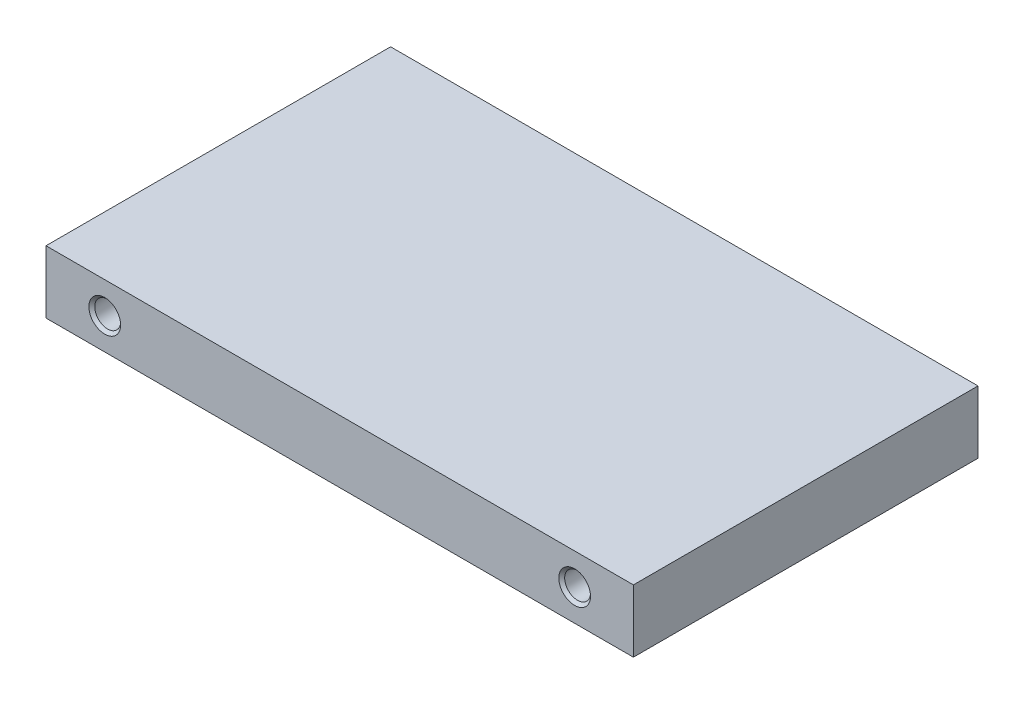
ISO-10303-21;
HEADER;
FILE_DESCRIPTION(('STEP AP214'),'2;1');
FILE_NAME('part.step','',(''),(''),'','','');
FILE_SCHEMA(('AUTOMOTIVE_DESIGN { 1 0 10303 214 1 1 1 1 }'));
ENDSEC;
DATA;
#1=APPLICATION_CONTEXT('core data for automotive mechanical design processes');
#2=APPLICATION_PROTOCOL_DEFINITION('international standard','automotive_design',2000,#1);
#3=PRODUCT_CONTEXT('',#1,'mechanical');
#4=PRODUCT('Part','Part','',(#3));
#5=PRODUCT_RELATED_PRODUCT_CATEGORY('part','',(#4));
#6=PRODUCT_DEFINITION_FORMATION('','',#4);
#7=PRODUCT_DEFINITION_CONTEXT('part definition',#1,'design');
#8=PRODUCT_DEFINITION('design','',#6,#7);
#9=PRODUCT_DEFINITION_SHAPE('','',#8);
#10=(LENGTH_UNIT() NAMED_UNIT(*) SI_UNIT(.MILLI.,.METRE.));
#11=(NAMED_UNIT(*) PLANE_ANGLE_UNIT() SI_UNIT($,.RADIAN.));
#12=(NAMED_UNIT(*) SI_UNIT($,.STERADIAN.) SOLID_ANGLE_UNIT());
#13=UNCERTAINTY_MEASURE_WITH_UNIT(LENGTH_MEASURE(1.E-05),#10,'distance_accuracy_value','');
#14=(GEOMETRIC_REPRESENTATION_CONTEXT(3) GLOBAL_UNCERTAINTY_ASSIGNED_CONTEXT((#13)) GLOBAL_UNIT_ASSIGNED_CONTEXT((#10,
#11,#12)) REPRESENTATION_CONTEXT('',''));
#15=CARTESIAN_POINT('',(0.,0.,0.));
#16=DIRECTION('',(0.,0.,1.));
#17=DIRECTION('',(1.,0.,0.));
#18=AXIS2_PLACEMENT_3D('',#15,#16,#17);
#19=CARTESIAN_POINT('',(21.5,8.,22.));
#20=DIRECTION('',(-1.,0.,0.));
#21=DIRECTION('',(0.,0.,1.));
#22=AXIS2_PLACEMENT_3D('',#19,#20,#21);
#23=PLANE('',#22);
#24=DIRECTION('',(0.,0.,-1.));
#25=VECTOR('',#24,1.);
#26=CARTESIAN_POINT('',(21.5,0.,22.));
#27=LINE('',#26,#25);
#28=CARTESIAN_POINT('',(21.5,0.,22.));
#29=VERTEX_POINT('',#28);
#30=CARTESIAN_POINT('',(21.5,0.,-22.));
#31=VERTEX_POINT('',#30);
#32=EDGE_CURVE('E104',#29,#31,#27,.T.);
#33=ORIENTED_EDGE('',*,*,#32,.T.);
#34=DIRECTION('',(0.,-1.,0.));
#35=VECTOR('',#34,1.);
#36=CARTESIAN_POINT('',(21.5,8.,-22.));
#37=LINE('',#36,#35);
#38=CARTESIAN_POINT('',(21.5,8.,-22.));
#39=VERTEX_POINT('',#38);
#40=EDGE_CURVE('E11',#39,#31,#37,.T.);
#41=ORIENTED_EDGE('',*,*,#40,.F.);
#42=DIRECTION('',(0.,0.,-1.));
#43=VECTOR('',#42,1.);
#44=CARTESIAN_POINT('',(21.5,8.,22.));
#45=LINE('',#44,#43);
#46=CARTESIAN_POINT('',(21.5,8.,22.));
#47=VERTEX_POINT('',#46);
#48=EDGE_CURVE('E92',#47,#39,#45,.T.);
#49=ORIENTED_EDGE('',*,*,#48,.F.);
#50=DIRECTION('',(0.,-1.,0.));
#51=VECTOR('',#50,1.);
#52=CARTESIAN_POINT('',(21.5,8.,22.));
#53=LINE('',#52,#51);
#54=EDGE_CURVE('E100',#47,#29,#53,.T.);
#55=ORIENTED_EDGE('',*,*,#54,.T.);
#56=EDGE_LOOP('',(#33,#41,#49,#55));
#57=FACE_BOUND('',#56,.T.);
#58=ADVANCED_FACE('F41',(#57),#23,.F.);
#59=CARTESIAN_POINT('',(21.5,8.,-22.));
#60=DIRECTION('',(0.,0.,1.));
#61=DIRECTION('',(1.,0.,0.));
#62=AXIS2_PLACEMENT_3D('',#59,#60,#61);
#63=PLANE('',#62);
#64=CARTESIAN_POINT('',(-46.,4.,-22.));
#65=DIRECTION('',(0.,0.,1.));
#66=DIRECTION('',(1.,0.,0.));
#67=AXIS2_PLACEMENT_3D('',#64,#65,#66);
#68=CIRCLE('',#67,1.64999999999999);
#69=CARTESIAN_POINT('',(-44.35,4.,-22.));
#70=VERTEX_POINT('',#69);
#71=EDGE_CURVE('E126',#70,#70,#68,.T.);
#72=ORIENTED_EDGE('',*,*,#71,.T.);
#73=EDGE_LOOP('',(#72));
#74=FACE_BOUND('',#73,.T.);
#75=CARTESIAN_POINT('',(14.,4.,-22.));
#76=DIRECTION('',(0.,0.,1.));
#77=DIRECTION('',(1.,0.,0.));
#78=AXIS2_PLACEMENT_3D('',#75,#76,#77);
#79=CIRCLE('',#78,1.64999999999999);
#80=CARTESIAN_POINT('',(15.65,4.,-22.));
#81=VERTEX_POINT('',#80);
#82=EDGE_CURVE('E107',#81,#81,#79,.T.);
#83=ORIENTED_EDGE('',*,*,#82,.T.);
#84=EDGE_LOOP('',(#83));
#85=FACE_BOUND('',#84,.T.);
#86=DIRECTION('',(-1.,0.,0.));
#87=VECTOR('',#86,1.);
#88=CARTESIAN_POINT('',(21.5,0.,-22.));
#89=LINE('',#88,#87);
#90=CARTESIAN_POINT('',(-53.5,0.,-22.));
#91=VERTEX_POINT('',#90);
#92=EDGE_CURVE('E96',#31,#91,#89,.T.);
#93=ORIENTED_EDGE('',*,*,#92,.T.);
#94=DIRECTION('',(0.,-1.,0.));
#95=VECTOR('',#94,1.);
#96=CARTESIAN_POINT('',(-53.5,8.,-22.));
#97=LINE('',#96,#95);
#98=CARTESIAN_POINT('',(-53.5,8.,-22.));
#99=VERTEX_POINT('',#98);
#100=EDGE_CURVE('E49',#99,#91,#97,.T.);
#101=ORIENTED_EDGE('',*,*,#100,.F.);
#102=DIRECTION('',(-1.,0.,0.));
#103=VECTOR('',#102,1.);
#104=CARTESIAN_POINT('',(21.5,8.,-22.));
#105=LINE('',#104,#103);
#106=EDGE_CURVE('E87',#39,#99,#105,.T.);
#107=ORIENTED_EDGE('',*,*,#106,.F.);
#108=ORIENTED_EDGE('',*,*,#40,.T.);
#109=EDGE_LOOP('',(#93,#101,#107,#108));
#110=FACE_BOUND('',#109,.T.);
#111=ADVANCED_FACE('F95',(#74,#85,#110),#63,.F.);
#112=CARTESIAN_POINT('',(-53.5,8.,-22.));
#113=DIRECTION('',(1.,0.,0.));
#114=DIRECTION('',(0.,0.,-1.));
#115=AXIS2_PLACEMENT_3D('',#112,#113,#114);
#116=PLANE('',#115);
#117=DIRECTION('',(0.,0.,1.));
#118=VECTOR('',#117,1.);
#119=CARTESIAN_POINT('',(-53.5,0.,-22.));
#120=LINE('',#119,#118);
#121=CARTESIAN_POINT('',(-53.5,0.,22.));
#122=VERTEX_POINT('',#121);
#123=EDGE_CURVE('E74',#91,#122,#120,.T.);
#124=ORIENTED_EDGE('',*,*,#123,.T.);
#125=DIRECTION('',(0.,-1.,0.));
#126=VECTOR('',#125,1.);
#127=CARTESIAN_POINT('',(-53.5,8.,22.));
#128=LINE('',#127,#126);
#129=CARTESIAN_POINT('',(-53.5,8.,22.));
#130=VERTEX_POINT('',#129);
#131=EDGE_CURVE('E97',#130,#122,#128,.T.);
#132=ORIENTED_EDGE('',*,*,#131,.F.);
#133=DIRECTION('',(0.,0.,1.));
#134=VECTOR('',#133,1.);
#135=CARTESIAN_POINT('',(-53.5,8.,-22.));
#136=LINE('',#135,#134);
#137=EDGE_CURVE('E90',#99,#130,#136,.T.);
#138=ORIENTED_EDGE('',*,*,#137,.F.);
#139=ORIENTED_EDGE('',*,*,#100,.T.);
#140=EDGE_LOOP('',(#124,#132,#138,#139));
#141=FACE_BOUND('',#140,.T.);
#142=ADVANCED_FACE('F98',(#141),#116,.F.);
#143=CARTESIAN_POINT('',(-53.5,8.,22.));
#144=DIRECTION('',(0.,0.,-1.));
#145=DIRECTION('',(-1.,0.,0.));
#146=AXIS2_PLACEMENT_3D('',#143,#144,#145);
#147=PLANE('',#146);
#148=CARTESIAN_POINT('',(-46.,4.,22.));
#149=DIRECTION('',(0.,0.,1.));
#150=DIRECTION('',(1.,0.,0.));
#151=AXIS2_PLACEMENT_3D('',#148,#149,#150);
#152=CIRCLE('',#151,2.025);
#153=CARTESIAN_POINT('',(-43.975,4.,22.));
#154=VERTEX_POINT('',#153);
#155=EDGE_CURVE('E132',#154,#154,#152,.T.);
#156=ORIENTED_EDGE('',*,*,#155,.F.);
#157=EDGE_LOOP('',(#156));
#158=FACE_BOUND('',#157,.T.);
#159=CARTESIAN_POINT('',(14.,4.,22.));
#160=DIRECTION('',(0.,0.,1.));
#161=DIRECTION('',(1.,0.,0.));
#162=AXIS2_PLACEMENT_3D('',#159,#160,#161);
#163=CIRCLE('',#162,2.025);
#164=CARTESIAN_POINT('',(16.025,4.,22.));
#165=VERTEX_POINT('',#164);
#166=EDGE_CURVE('E123',#165,#165,#163,.T.);
#167=ORIENTED_EDGE('',*,*,#166,.F.);
#168=EDGE_LOOP('',(#167));
#169=FACE_BOUND('',#168,.T.);
#170=DIRECTION('',(1.,0.,0.));
#171=VECTOR('',#170,1.);
#172=CARTESIAN_POINT('',(-53.5,0.,22.));
#173=LINE('',#172,#171);
#174=EDGE_CURVE('E80',#122,#29,#173,.T.);
#175=ORIENTED_EDGE('',*,*,#174,.T.);
#176=ORIENTED_EDGE('',*,*,#54,.F.);
#177=DIRECTION('',(1.,0.,0.));
#178=VECTOR('',#177,1.);
#179=CARTESIAN_POINT('',(-53.5,8.,22.));
#180=LINE('',#179,#178);
#181=EDGE_CURVE('E57',#130,#47,#180,.T.);
#182=ORIENTED_EDGE('',*,*,#181,.F.);
#183=ORIENTED_EDGE('',*,*,#131,.T.);
#184=EDGE_LOOP('',(#175,#176,#182,#183));
#185=FACE_BOUND('',#184,.T.);
#186=ADVANCED_FACE('F112',(#158,#169,#185),#147,.F.);
#187=CARTESIAN_POINT('',(0.,8.,0.));
#188=DIRECTION('',(0.,1.,0.));
#189=DIRECTION('',(0.,0.,1.));
#190=AXIS2_PLACEMENT_3D('',#187,#188,#189);
#191=PLANE('',#190);
#192=ORIENTED_EDGE('',*,*,#48,.T.);
#193=ORIENTED_EDGE('',*,*,#106,.T.);
#194=ORIENTED_EDGE('',*,*,#137,.T.);
#195=ORIENTED_EDGE('',*,*,#181,.T.);
#196=EDGE_LOOP('',(#192,#193,#194,#195));
#197=FACE_BOUND('',#196,.T.);
#198=ADVANCED_FACE('F88',(#197),#191,.T.);
#199=CARTESIAN_POINT('',(0.,0.,0.));
#200=DIRECTION('',(0.,1.,0.));
#201=DIRECTION('',(0.,0.,1.));
#202=AXIS2_PLACEMENT_3D('',#199,#200,#201);
#203=PLANE('',#202);
#204=ORIENTED_EDGE('',*,*,#32,.F.);
#205=ORIENTED_EDGE('',*,*,#174,.F.);
#206=ORIENTED_EDGE('',*,*,#123,.F.);
#207=ORIENTED_EDGE('',*,*,#92,.F.);
#208=EDGE_LOOP('',(#204,#205,#206,#207));
#209=FACE_BOUND('',#208,.T.);
#210=ADVANCED_FACE('F115',(#209),#203,.F.);
#211=CARTESIAN_POINT('',(14.,4.,22.));
#212=DIRECTION('',(0.,0.,1.));
#213=DIRECTION('',(1.,0.,0.));
#214=AXIS2_PLACEMENT_3D('',#211,#212,#213);
#215=CYLINDRICAL_SURFACE('',#214,1.64999999999999);
#216=ORIENTED_EDGE('',*,*,#82,.F.);
#217=EDGE_LOOP('',(#216));
#218=FACE_BOUND('',#217,.T.);
#219=CARTESIAN_POINT('',(14.,4.,21.625));
#220=DIRECTION('',(0.,0.,1.));
#221=DIRECTION('',(1.,0.,0.));
#222=AXIS2_PLACEMENT_3D('',#219,#220,#221);
#223=CIRCLE('',#222,1.65);
#224=CARTESIAN_POINT('',(15.65,4.,21.625));
#225=VERTEX_POINT('',#224);
#226=EDGE_CURVE('E120',#225,#225,#223,.T.);
#227=ORIENTED_EDGE('',*,*,#226,.T.);
#228=EDGE_LOOP('',(#227));
#229=FACE_BOUND('',#228,.T.);
#230=ADVANCED_FACE('F146',(#218,#229),#215,.F.);
#231=CARTESIAN_POINT('',(14.,4.,22.));
#232=DIRECTION('',(0.,0.,1.));
#233=DIRECTION('',(1.,0.,0.));
#234=AXIS2_PLACEMENT_3D('',#231,#232,#233);
#235=CONICAL_SURFACE('',#234,2.025,0.785398163397453);
#236=ORIENTED_EDGE('',*,*,#226,.F.);
#237=EDGE_LOOP('',(#236));
#238=FACE_BOUND('',#237,.T.);
#239=ORIENTED_EDGE('',*,*,#166,.T.);
#240=EDGE_LOOP('',(#239));
#241=FACE_BOUND('',#240,.T.);
#242=ADVANCED_FACE('F143',(#238,#241),#235,.F.);
#243=CARTESIAN_POINT('',(-46.,4.,22.));
#244=DIRECTION('',(0.,0.,1.));
#245=DIRECTION('',(1.,0.,0.));
#246=AXIS2_PLACEMENT_3D('',#243,#244,#245);
#247=CYLINDRICAL_SURFACE('',#246,1.64999999999999);
#248=ORIENTED_EDGE('',*,*,#71,.F.);
#249=EDGE_LOOP('',(#248));
#250=FACE_BOUND('',#249,.T.);
#251=CARTESIAN_POINT('',(-46.,4.,21.625));
#252=DIRECTION('',(0.,0.,1.));
#253=DIRECTION('',(1.,0.,0.));
#254=AXIS2_PLACEMENT_3D('',#251,#252,#253);
#255=CIRCLE('',#254,1.64999999999999);
#256=CARTESIAN_POINT('',(-44.35,4.,21.625));
#257=VERTEX_POINT('',#256);
#258=EDGE_CURVE('E129',#257,#257,#255,.T.);
#259=ORIENTED_EDGE('',*,*,#258,.T.);
#260=EDGE_LOOP('',(#259));
#261=FACE_BOUND('',#260,.T.);
#262=ADVANCED_FACE('F145',(#250,#261),#247,.F.);
#263=CARTESIAN_POINT('',(-46.,4.,22.));
#264=DIRECTION('',(0.,0.,1.));
#265=DIRECTION('',(1.,0.,0.));
#266=AXIS2_PLACEMENT_3D('',#263,#264,#265);
#267=CONICAL_SURFACE('',#266,2.025,0.785398163397458);
#268=ORIENTED_EDGE('',*,*,#258,.F.);
#269=EDGE_LOOP('',(#268));
#270=FACE_BOUND('',#269,.T.);
#271=ORIENTED_EDGE('',*,*,#155,.T.);
#272=EDGE_LOOP('',(#271));
#273=FACE_BOUND('',#272,.T.);
#274=ADVANCED_FACE('F136',(#270,#273),#267,.F.);
#275=CLOSED_SHELL('',(#58,#111,#142,#186,#198,#210,#230,#242,#262,#274));
#276=MANIFOLD_SOLID_BREP('B2',#275);
#277=ADVANCED_BREP_SHAPE_REPRESENTATION('',(#18,#276),#14);
#278=SHAPE_DEFINITION_REPRESENTATION(#9,#277);
ENDSEC;
END-ISO-10303-21;
